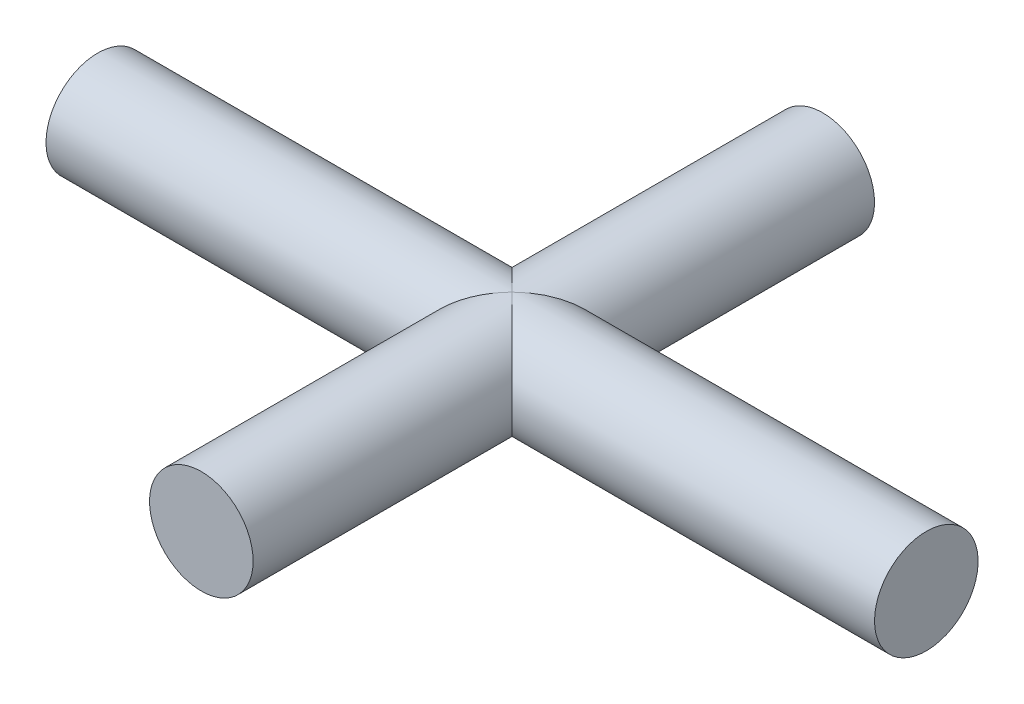
ISO-10303-21;
HEADER;
FILE_DESCRIPTION(('STEP AP214'),'2;1');
FILE_NAME('part.step','',(''),(''),'','','');
FILE_SCHEMA(('AUTOMOTIVE_DESIGN { 1 0 10303 214 1 1 1 1 }'));
ENDSEC;
DATA;
#1=APPLICATION_CONTEXT('core data for automotive mechanical design processes');
#2=APPLICATION_PROTOCOL_DEFINITION('international standard','automotive_design',2000,#1);
#3=PRODUCT_CONTEXT('',#1,'mechanical');
#4=PRODUCT('Part','Part','',(#3));
#5=PRODUCT_RELATED_PRODUCT_CATEGORY('part','',(#4));
#6=PRODUCT_DEFINITION_FORMATION('','',#4);
#7=PRODUCT_DEFINITION_CONTEXT('part definition',#1,'design');
#8=PRODUCT_DEFINITION('design','',#6,#7);
#9=PRODUCT_DEFINITION_SHAPE('','',#8);
#10=(LENGTH_UNIT() NAMED_UNIT(*) SI_UNIT(.MILLI.,.METRE.));
#11=(NAMED_UNIT(*) PLANE_ANGLE_UNIT() SI_UNIT($,.RADIAN.));
#12=(NAMED_UNIT(*) SI_UNIT($,.STERADIAN.) SOLID_ANGLE_UNIT());
#13=UNCERTAINTY_MEASURE_WITH_UNIT(LENGTH_MEASURE(1.E-05),#10,'distance_accuracy_value','');
#14=(GEOMETRIC_REPRESENTATION_CONTEXT(3) GLOBAL_UNCERTAINTY_ASSIGNED_CONTEXT((#13)) GLOBAL_UNIT_ASSIGNED_CONTEXT((#10,
#11,#12)) REPRESENTATION_CONTEXT('',''));
#15=CARTESIAN_POINT('',(0.,0.,0.));
#16=DIRECTION('',(0.,0.,1.));
#17=DIRECTION('',(1.,0.,0.));
#18=AXIS2_PLACEMENT_3D('',#15,#16,#17);
#19=CARTESIAN_POINT('',(40.,0.,0.));
#20=DIRECTION('',(-1.,0.,0.));
#21=DIRECTION('',(0.,0.,1.));
#22=AXIS2_PLACEMENT_3D('',#19,#20,#21);
#23=PLANE('',#22);
#24=CARTESIAN_POINT('',(40.,0.,0.));
#25=DIRECTION('',(-1.,0.,0.));
#26=DIRECTION('',(0.,0.,1.));
#27=AXIS2_PLACEMENT_3D('',#24,#25,#26);
#28=CIRCLE('',#27,5.00000000000001);
#29=CARTESIAN_POINT('',(40.,0.,5.00000000000001));
#30=VERTEX_POINT('',#29);
#31=EDGE_CURVE('E74',#30,#30,#28,.T.);
#32=ORIENTED_EDGE('',*,*,#31,.F.);
#33=EDGE_LOOP('',(#32));
#34=FACE_BOUND('',#33,.T.);
#35=ADVANCED_FACE('F35',(#34),#23,.F.);
#36=CARTESIAN_POINT('',(-40.,0.,0.));
#37=DIRECTION('',(-1.,0.,0.));
#38=DIRECTION('',(0.,0.,1.));
#39=AXIS2_PLACEMENT_3D('',#36,#37,#38);
#40=CYLINDRICAL_SURFACE('',#39,5.00000000000001);
#41=CARTESIAN_POINT('',(0.,0.,0.));
#42=DIRECTION('',(-0.707106781186547,0.,0.707106781186547));
#43=DIRECTION('',(-0.707106781186547,0.,-0.707106781186547));
#44=AXIS2_PLACEMENT_3D('',#41,#42,#43);
#45=ELLIPSE('',#44,7.07106781186548,5.);
#46=CARTESIAN_POINT('',(0.,-5.,0.));
#47=VERTEX_POINT('',#46);
#48=CARTESIAN_POINT('',(0.,5.,0.));
#49=VERTEX_POINT('',#48);
#50=EDGE_CURVE('E42',#47,#49,#45,.T.);
#51=ORIENTED_EDGE('',*,*,#50,.F.);
#52=CARTESIAN_POINT('',(0.,0.,0.));
#53=DIRECTION('',(-0.707106781186547,0.,-0.707106781186547));
#54=DIRECTION('',(-0.707106781186547,0.,0.707106781186547));
#55=AXIS2_PLACEMENT_3D('',#52,#53,#54);
#56=ELLIPSE('',#55,7.07106781186548,5.);
#57=EDGE_CURVE('E54',#49,#47,#56,.T.);
#58=ORIENTED_EDGE('',*,*,#57,.F.);
#59=EDGE_LOOP('',(#51,#58));
#60=FACE_BOUND('',#59,.T.);
#61=ORIENTED_EDGE('',*,*,#31,.T.);
#62=EDGE_LOOP('',(#61));
#63=FACE_BOUND('',#62,.T.);
#64=ADVANCED_FACE('F55',(#60,#63),#40,.T.);
#65=CARTESIAN_POINT('',(4.99999999999997,0.,30.));
#66=DIRECTION('',(0.,0.,1.));
#67=DIRECTION('',(1.,0.,0.));
#68=AXIS2_PLACEMENT_3D('',#65,#66,#67);
#69=PLANE('',#68);
#70=CARTESIAN_POINT('',(0.,0.,30.));
#71=DIRECTION('',(0.,0.,1.));
#72=DIRECTION('',(1.,0.,0.));
#73=AXIS2_PLACEMENT_3D('',#70,#71,#72);
#74=CIRCLE('',#73,5.);
#75=CARTESIAN_POINT('',(4.99999999999997,0.,30.));
#76=VERTEX_POINT('',#75);
#77=EDGE_CURVE('E75',#76,#76,#74,.T.);
#78=ORIENTED_EDGE('',*,*,#77,.T.);
#79=EDGE_LOOP('',(#78));
#80=FACE_BOUND('',#79,.T.);
#81=ADVANCED_FACE('F94',(#80),#69,.T.);
#82=CARTESIAN_POINT('',(0.,0.,30.));
#83=DIRECTION('',(0.,0.,1.));
#84=DIRECTION('',(1.,0.,0.));
#85=AXIS2_PLACEMENT_3D('',#82,#83,#84);
#86=CYLINDRICAL_SURFACE('',#85,5.);
#87=ORIENTED_EDGE('',*,*,#77,.F.);
#88=EDGE_LOOP('',(#87));
#89=FACE_BOUND('',#88,.T.);
#90=CARTESIAN_POINT('',(0.,0.,0.));
#91=DIRECTION('',(-0.707106781186547,0.,-0.707106781186547));
#92=DIRECTION('',(-0.707106781186547,0.,0.707106781186547));
#93=AXIS2_PLACEMENT_3D('',#90,#91,#92);
#94=ELLIPSE('',#93,7.07106781186548,5.);
#95=EDGE_CURVE('E48',#49,#47,#94,.F.);
#96=ORIENTED_EDGE('',*,*,#95,.T.);
#97=ORIENTED_EDGE('',*,*,#50,.T.);
#98=EDGE_LOOP('',(#96,#97));
#99=FACE_BOUND('',#98,.T.);
#100=ADVANCED_FACE('F64',(#89,#99),#86,.T.);
#101=CARTESIAN_POINT('',(-40.,0.,0.));
#102=DIRECTION('',(-1.,0.,0.));
#103=DIRECTION('',(0.,0.,1.));
#104=AXIS2_PLACEMENT_3D('',#101,#102,#103);
#105=PLANE('',#104);
#106=CARTESIAN_POINT('',(-40.,0.,0.));
#107=DIRECTION('',(-1.,0.,0.));
#108=DIRECTION('',(0.,0.,1.));
#109=AXIS2_PLACEMENT_3D('',#106,#107,#108);
#110=CIRCLE('',#109,5.00000000000001);
#111=CARTESIAN_POINT('',(-40.,0.,5.00000000000001));
#112=VERTEX_POINT('',#111);
#113=EDGE_CURVE('E62',#112,#112,#110,.T.);
#114=ORIENTED_EDGE('',*,*,#113,.T.);
#115=EDGE_LOOP('',(#114));
#116=FACE_BOUND('',#115,.T.);
#117=ADVANCED_FACE('F85',(#116),#105,.T.);
#118=CARTESIAN_POINT('',(0.,0.,0.));
#119=DIRECTION('',(-0.707106781186547,0.,0.707106781186547));
#120=DIRECTION('',(-0.707106781186547,0.,-0.707106781186547));
#121=AXIS2_PLACEMENT_3D('',#118,#119,#120);
#122=ELLIPSE('',#121,7.07106781186548,5.);
#123=EDGE_CURVE('E11',#47,#49,#122,.F.);
#124=ORIENTED_EDGE('',*,*,#123,.F.);
#125=ORIENTED_EDGE('',*,*,#95,.F.);
#126=EDGE_LOOP('',(#124,#125));
#127=FACE_BOUND('',#126,.T.);
#128=ORIENTED_EDGE('',*,*,#113,.F.);
#129=EDGE_LOOP('',(#128));
#130=FACE_BOUND('',#129,.T.);
#131=ADVANCED_FACE('F60',(#127,#130),#40,.T.);
#132=CARTESIAN_POINT('',(4.99999999999997,0.,-30.));
#133=DIRECTION('',(0.,0.,-1.));
#134=DIRECTION('',(-1.,0.,0.));
#135=AXIS2_PLACEMENT_3D('',#132,#133,#134);
#136=PLANE('',#135);
#137=CARTESIAN_POINT('',(0.,0.,-30.));
#138=DIRECTION('',(0.,0.,1.));
#139=DIRECTION('',(1.,0.,0.));
#140=AXIS2_PLACEMENT_3D('',#137,#138,#139);
#141=CIRCLE('',#140,5.);
#142=CARTESIAN_POINT('',(4.99999999999997,0.,-30.));
#143=VERTEX_POINT('',#142);
#144=EDGE_CURVE('E72',#143,#143,#141,.T.);
#145=ORIENTED_EDGE('',*,*,#144,.F.);
#146=EDGE_LOOP('',(#145));
#147=FACE_BOUND('',#146,.T.);
#148=ADVANCED_FACE('F68',(#147),#136,.T.);
#149=ORIENTED_EDGE('',*,*,#57,.T.);
#150=ORIENTED_EDGE('',*,*,#123,.T.);
#151=EDGE_LOOP('',(#149,#150));
#152=FACE_BOUND('',#151,.T.);
#153=ORIENTED_EDGE('',*,*,#144,.T.);
#154=EDGE_LOOP('',(#153));
#155=FACE_BOUND('',#154,.T.);
#156=ADVANCED_FACE('F65',(#152,#155),#86,.T.);
#157=CLOSED_SHELL('',(#35,#64,#81,#100,#117,#131,#148,#156));
#158=MANIFOLD_SOLID_BREP('B2',#157);
#159=ADVANCED_BREP_SHAPE_REPRESENTATION('',(#18,#158),#14);
#160=SHAPE_DEFINITION_REPRESENTATION(#9,#159);
ENDSEC;
END-ISO-10303-21;
